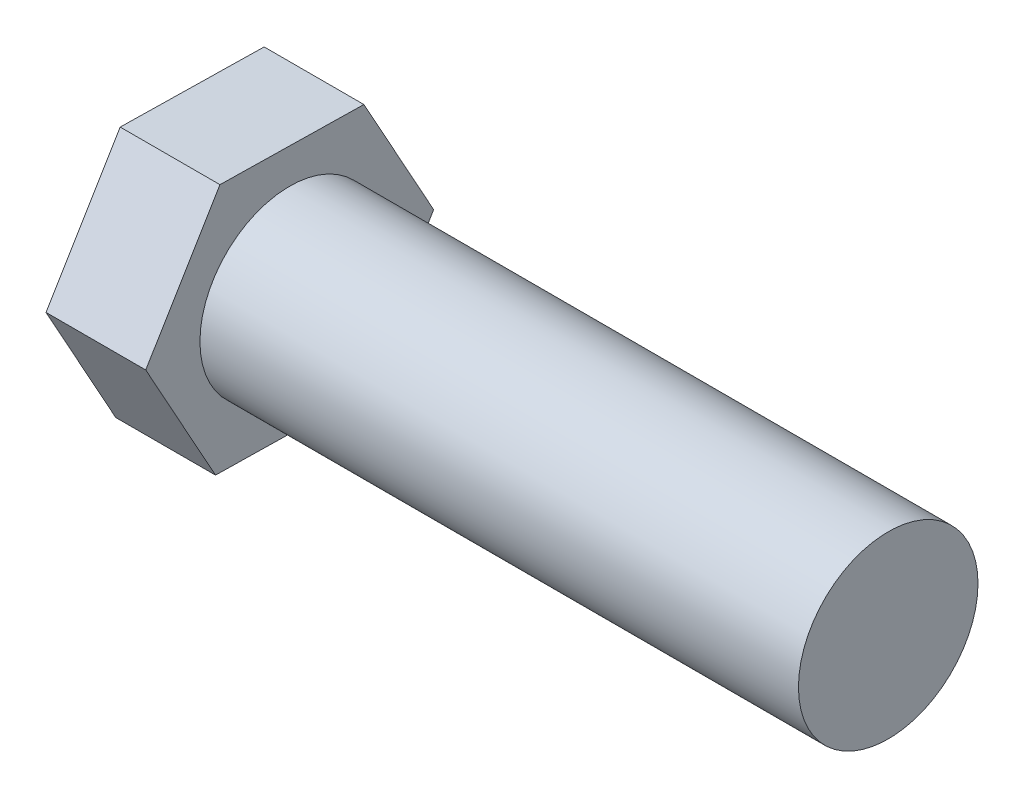
ISO-10303-21;
HEADER;
FILE_DESCRIPTION(('STEP AP214'),'2;1');
FILE_NAME('part.step','',(''),(''),'','','');
FILE_SCHEMA(('AUTOMOTIVE_DESIGN { 1 0 10303 214 1 1 1 1 }'));
ENDSEC;
DATA;
#1=APPLICATION_CONTEXT('core data for automotive mechanical design processes');
#2=APPLICATION_PROTOCOL_DEFINITION('international standard','automotive_design',2000,#1);
#3=PRODUCT_CONTEXT('',#1,'mechanical');
#4=PRODUCT('Part','Part','',(#3));
#5=PRODUCT_RELATED_PRODUCT_CATEGORY('part','',(#4));
#6=PRODUCT_DEFINITION_FORMATION('','',#4);
#7=PRODUCT_DEFINITION_CONTEXT('part definition',#1,'design');
#8=PRODUCT_DEFINITION('design','',#6,#7);
#9=PRODUCT_DEFINITION_SHAPE('','',#8);
#10=(LENGTH_UNIT() NAMED_UNIT(*) SI_UNIT(.MILLI.,.METRE.));
#11=(NAMED_UNIT(*) PLANE_ANGLE_UNIT() SI_UNIT($,.RADIAN.));
#12=(NAMED_UNIT(*) SI_UNIT($,.STERADIAN.) SOLID_ANGLE_UNIT());
#13=UNCERTAINTY_MEASURE_WITH_UNIT(LENGTH_MEASURE(1.E-05),#10,'distance_accuracy_value','');
#14=(GEOMETRIC_REPRESENTATION_CONTEXT(3) GLOBAL_UNCERTAINTY_ASSIGNED_CONTEXT((#13)) GLOBAL_UNIT_ASSIGNED_CONTEXT((#10,
#11,#12)) REPRESENTATION_CONTEXT('',''));
#15=CARTESIAN_POINT('',(0.,0.,0.));
#16=DIRECTION('',(0.,0.,1.));
#17=DIRECTION('',(1.,0.,0.));
#18=AXIS2_PLACEMENT_3D('',#15,#16,#17);
#19=CARTESIAN_POINT('',(-0.6,0.,0.));
#20=DIRECTION('',(-1.,0.,0.));
#21=DIRECTION('',(0.,0.,1.));
#22=AXIS2_PLACEMENT_3D('',#19,#20,#21);
#23=PLANE('',#22);
#24=DIRECTION('',(0.,0.856988725408425,-0.515335157468267));
#25=VECTOR('',#24,1.);
#26=CARTESIAN_POINT('',(-0.6,0.256906077015476,14.4314702161951));
#27=LINE('',#26,#25);
#28=CARTESIAN_POINT('',(-0.6,0.256906077015476,14.4314702161951));
#29=VERTEX_POINT('',#28);
#30=CARTESIAN_POINT('',(-0.6,12.6264728596912,6.99324791901554));
#31=VERTEX_POINT('',#30);
#32=EDGE_CURVE('E126',#29,#31,#27,.T.);
#33=ORIENTED_EDGE('',*,*,#32,.F.);
#34=DIRECTION('',(0.,0.874787700534985,0.484506428226409));
#35=VECTOR('',#34,1.);
#36=CARTESIAN_POINT('',(-0.6,-12.3695667826757,7.43822229717955));
#37=LINE('',#36,#35);
#38=CARTESIAN_POINT('',(-0.6,-12.3695667826757,7.43822229717955));
#39=VERTEX_POINT('',#38);
#40=EDGE_CURVE('E86',#39,#29,#37,.T.);
#41=ORIENTED_EDGE('',*,*,#40,.F.);
#42=DIRECTION('',(0.,0.0177989751265602,0.999841585694676));
#43=VECTOR('',#42,1.);
#44=CARTESIAN_POINT('',(-0.6,-12.6264728596912,-6.99324791901554));
#45=LINE('',#44,#43);
#46=CARTESIAN_POINT('',(-0.6,-12.6264728596912,-6.99324791901554));
#47=VERTEX_POINT('',#46);
#48=EDGE_CURVE('E80',#47,#39,#45,.T.);
#49=ORIENTED_EDGE('',*,*,#48,.F.);
#50=DIRECTION('',(0.,-0.856988725408425,0.515335157468266));
#51=VECTOR('',#50,1.);
#52=CARTESIAN_POINT('',(-0.6,-0.256906077015476,-14.4314702161951));
#53=LINE('',#52,#51);
#54=CARTESIAN_POINT('',(-0.6,-0.256906077015476,-14.4314702161951));
#55=VERTEX_POINT('',#54);
#56=EDGE_CURVE('E116',#55,#47,#53,.T.);
#57=ORIENTED_EDGE('',*,*,#56,.F.);
#58=DIRECTION('',(0.,-0.874787700534985,-0.484506428226409));
#59=VECTOR('',#58,1.);
#60=CARTESIAN_POINT('',(-0.6,12.3695667826757,-7.43822229717955));
#61=LINE('',#60,#59);
#62=CARTESIAN_POINT('',(-0.6,12.3695667826757,-7.43822229717955));
#63=VERTEX_POINT('',#62);
#64=EDGE_CURVE('E131',#63,#55,#61,.T.);
#65=ORIENTED_EDGE('',*,*,#64,.F.);
#66=DIRECTION('',(0.,-0.01779897512656,-0.999841585694676));
#67=VECTOR('',#66,1.);
#68=CARTESIAN_POINT('',(-0.6,12.6264728596912,6.99324791901554));
#69=LINE('',#68,#67);
#70=EDGE_CURVE('E129',#31,#63,#69,.T.);
#71=ORIENTED_EDGE('',*,*,#70,.F.);
#72=EDGE_LOOP('',(#33,#41,#49,#57,#65,#71));
#73=FACE_BOUND('',#72,.T.);
#74=CARTESIAN_POINT('',(-0.600000000000003,0.,0.));
#75=DIRECTION('',(-1.,0.,0.));
#76=DIRECTION('',(0.,0.,1.));
#77=AXIS2_PLACEMENT_3D('',#74,#75,#76);
#78=CIRCLE('',#77,9.);
#79=CARTESIAN_POINT('',(-0.600000000000003,0.,9.));
#80=VERTEX_POINT('',#79);
#81=EDGE_CURVE('E49',#80,#80,#78,.T.);
#82=ORIENTED_EDGE('',*,*,#81,.T.);
#83=EDGE_LOOP('',(#82));
#84=FACE_BOUND('',#83,.T.);
#85=ADVANCED_FACE('F40',(#73,#84),#23,.F.);
#86=CARTESIAN_POINT('',(-10.6,0.256906077015476,14.4314702161951));
#87=DIRECTION('',(0.,-0.515335157468267,-0.856988725408425));
#88=DIRECTION('',(0.,0.856988725408425,-0.515335157468267));
#89=AXIS2_PLACEMENT_3D('',#86,#87,#88);
#90=PLANE('',#89);
#91=ORIENTED_EDGE('',*,*,#32,.T.);
#92=DIRECTION('',(1.,0.,0.));
#93=VECTOR('',#92,1.);
#94=CARTESIAN_POINT('',(-10.6,12.6264728596912,6.99324791901554));
#95=LINE('',#94,#93);
#96=CARTESIAN_POINT('',(-10.6,12.6264728596912,6.99324791901554));
#97=VERTEX_POINT('',#96);
#98=EDGE_CURVE('E143',#97,#31,#95,.T.);
#99=ORIENTED_EDGE('',*,*,#98,.F.);
#100=DIRECTION('',(0.,0.856988725408425,-0.515335157468267));
#101=VECTOR('',#100,1.);
#102=CARTESIAN_POINT('',(-10.6,0.256906077015476,14.4314702161951));
#103=LINE('',#102,#101);
#104=CARTESIAN_POINT('',(-10.6,0.256906077015476,14.4314702161951));
#105=VERTEX_POINT('',#104);
#106=EDGE_CURVE('E136',#105,#97,#103,.T.);
#107=ORIENTED_EDGE('',*,*,#106,.F.);
#108=DIRECTION('',(1.,0.,0.));
#109=VECTOR('',#108,1.);
#110=CARTESIAN_POINT('',(-10.6,0.256906077015476,14.4314702161951));
#111=LINE('',#110,#109);
#112=EDGE_CURVE('E122',#105,#29,#111,.T.);
#113=ORIENTED_EDGE('',*,*,#112,.T.);
#114=EDGE_LOOP('',(#91,#99,#107,#113));
#115=FACE_BOUND('',#114,.T.);
#116=ADVANCED_FACE('F160',(#115),#90,.F.);
#117=CARTESIAN_POINT('',(-10.6,12.6264728596912,6.99324791901554));
#118=DIRECTION('',(0.,-0.999841585694676,0.01779897512656));
#119=DIRECTION('',(0.,-0.01779897512656,-0.999841585694676));
#120=AXIS2_PLACEMENT_3D('',#117,#118,#119);
#121=PLANE('',#120);
#122=ORIENTED_EDGE('',*,*,#70,.T.);
#123=DIRECTION('',(1.,0.,0.));
#124=VECTOR('',#123,1.);
#125=CARTESIAN_POINT('',(-10.6,12.3695667826757,-7.43822229717955));
#126=LINE('',#125,#124);
#127=CARTESIAN_POINT('',(-10.6,12.3695667826757,-7.43822229717955));
#128=VERTEX_POINT('',#127);
#129=EDGE_CURVE('E140',#128,#63,#126,.T.);
#130=ORIENTED_EDGE('',*,*,#129,.F.);
#131=DIRECTION('',(0.,-0.01779897512656,-0.999841585694676));
#132=VECTOR('',#131,1.);
#133=CARTESIAN_POINT('',(-10.6,12.6264728596912,6.99324791901554));
#134=LINE('',#133,#132);
#135=EDGE_CURVE('E95',#97,#128,#134,.T.);
#136=ORIENTED_EDGE('',*,*,#135,.F.);
#137=ORIENTED_EDGE('',*,*,#98,.T.);
#138=EDGE_LOOP('',(#122,#130,#136,#137));
#139=FACE_BOUND('',#138,.T.);
#140=ADVANCED_FACE('F166',(#139),#121,.F.);
#141=CARTESIAN_POINT('',(-10.6,12.3695667826757,-7.43822229717955));
#142=DIRECTION('',(0.,-0.484506428226409,0.874787700534986));
#143=DIRECTION('',(0.,-0.874787700534986,-0.484506428226409));
#144=AXIS2_PLACEMENT_3D('',#141,#142,#143);
#145=PLANE('',#144);
#146=ORIENTED_EDGE('',*,*,#64,.T.);
#147=DIRECTION('',(1.,0.,0.));
#148=VECTOR('',#147,1.);
#149=CARTESIAN_POINT('',(-10.6,-0.256906077015476,-14.4314702161951));
#150=LINE('',#149,#148);
#151=CARTESIAN_POINT('',(-10.6,-0.256906077015476,-14.4314702161951));
#152=VERTEX_POINT('',#151);
#153=EDGE_CURVE('E117',#152,#55,#150,.T.);
#154=ORIENTED_EDGE('',*,*,#153,.F.);
#155=DIRECTION('',(0.,-0.874787700534985,-0.484506428226409));
#156=VECTOR('',#155,1.);
#157=CARTESIAN_POINT('',(-10.6,12.3695667826757,-7.43822229717955));
#158=LINE('',#157,#156);
#159=EDGE_CURVE('E108',#128,#152,#158,.T.);
#160=ORIENTED_EDGE('',*,*,#159,.F.);
#161=ORIENTED_EDGE('',*,*,#129,.T.);
#162=EDGE_LOOP('',(#146,#154,#160,#161));
#163=FACE_BOUND('',#162,.T.);
#164=ADVANCED_FACE('F177',(#163),#145,.F.);
#165=CARTESIAN_POINT('',(-10.6,-0.256906077015476,-14.4314702161951));
#166=DIRECTION('',(0.,0.515335157468266,0.856988725408425));
#167=DIRECTION('',(0.,-0.856988725408425,0.515335157468266));
#168=AXIS2_PLACEMENT_3D('',#165,#166,#167);
#169=PLANE('',#168);
#170=ORIENTED_EDGE('',*,*,#56,.T.);
#171=DIRECTION('',(1.,0.,0.));
#172=VECTOR('',#171,1.);
#173=CARTESIAN_POINT('',(-10.6,-12.6264728596912,-6.99324791901554));
#174=LINE('',#173,#172);
#175=CARTESIAN_POINT('',(-10.6,-12.6264728596912,-6.99324791901554));
#176=VERTEX_POINT('',#175);
#177=EDGE_CURVE('E113',#176,#47,#174,.T.);
#178=ORIENTED_EDGE('',*,*,#177,.F.);
#179=DIRECTION('',(0.,-0.856988725408425,0.515335157468266));
#180=VECTOR('',#179,1.);
#181=CARTESIAN_POINT('',(-10.6,-0.256906077015476,-14.4314702161951));
#182=LINE('',#181,#180);
#183=EDGE_CURVE('E102',#152,#176,#182,.T.);
#184=ORIENTED_EDGE('',*,*,#183,.F.);
#185=ORIENTED_EDGE('',*,*,#153,.T.);
#186=EDGE_LOOP('',(#170,#178,#184,#185));
#187=FACE_BOUND('',#186,.T.);
#188=ADVANCED_FACE('F114',(#187),#169,.F.);
#189=CARTESIAN_POINT('',(-10.6,-12.6264728596912,-6.99324791901554));
#190=DIRECTION('',(0.,0.999841585694676,-0.0177989751265602));
#191=DIRECTION('',(0.,0.0177989751265602,0.999841585694676));
#192=AXIS2_PLACEMENT_3D('',#189,#190,#191);
#193=PLANE('',#192);
#194=ORIENTED_EDGE('',*,*,#48,.T.);
#195=DIRECTION('',(1.,0.,0.));
#196=VECTOR('',#195,1.);
#197=CARTESIAN_POINT('',(-10.6,-12.3695667826757,7.43822229717955));
#198=LINE('',#197,#196);
#199=CARTESIAN_POINT('',(-10.6,-12.3695667826757,7.43822229717955));
#200=VERTEX_POINT('',#199);
#201=EDGE_CURVE('E118',#200,#39,#198,.T.);
#202=ORIENTED_EDGE('',*,*,#201,.F.);
#203=DIRECTION('',(0.,0.0177989751265602,0.999841585694676));
#204=VECTOR('',#203,1.);
#205=CARTESIAN_POINT('',(-10.6,-12.6264728596912,-6.99324791901554));
#206=LINE('',#205,#204);
#207=EDGE_CURVE('E106',#176,#200,#206,.T.);
#208=ORIENTED_EDGE('',*,*,#207,.F.);
#209=ORIENTED_EDGE('',*,*,#177,.T.);
#210=EDGE_LOOP('',(#194,#202,#208,#209));
#211=FACE_BOUND('',#210,.T.);
#212=ADVANCED_FACE('F120',(#211),#193,.F.);
#213=CARTESIAN_POINT('',(-10.6,-12.3695667826757,7.43822229717955));
#214=DIRECTION('',(0.,0.48450642822641,-0.874787700534985));
#215=DIRECTION('',(0.,0.874787700534985,0.48450642822641));
#216=AXIS2_PLACEMENT_3D('',#213,#214,#215);
#217=PLANE('',#216);
#218=ORIENTED_EDGE('',*,*,#40,.T.);
#219=ORIENTED_EDGE('',*,*,#112,.F.);
#220=DIRECTION('',(0.,0.874787700534985,0.484506428226409));
#221=VECTOR('',#220,1.);
#222=CARTESIAN_POINT('',(-10.6,-12.3695667826757,7.43822229717955));
#223=LINE('',#222,#221);
#224=EDGE_CURVE('E57',#200,#105,#223,.T.);
#225=ORIENTED_EDGE('',*,*,#224,.F.);
#226=ORIENTED_EDGE('',*,*,#201,.T.);
#227=EDGE_LOOP('',(#218,#219,#225,#226));
#228=FACE_BOUND('',#227,.T.);
#229=ADVANCED_FACE('F156',(#228),#217,.F.);
#230=CARTESIAN_POINT('',(-10.6,0.,0.));
#231=DIRECTION('',(-1.,0.,0.));
#232=DIRECTION('',(0.,0.,1.));
#233=AXIS2_PLACEMENT_3D('',#230,#231,#232);
#234=PLANE('',#233);
#235=ORIENTED_EDGE('',*,*,#106,.T.);
#236=ORIENTED_EDGE('',*,*,#135,.T.);
#237=ORIENTED_EDGE('',*,*,#159,.T.);
#238=ORIENTED_EDGE('',*,*,#183,.T.);
#239=ORIENTED_EDGE('',*,*,#207,.T.);
#240=ORIENTED_EDGE('',*,*,#224,.T.);
#241=EDGE_LOOP('',(#235,#236,#237,#238,#239,#240));
#242=FACE_BOUND('',#241,.T.);
#243=ADVANCED_FACE('F104',(#242),#234,.T.);
#244=CARTESIAN_POINT('',(59.4,0.,0.));
#245=DIRECTION('',(-1.,0.,0.));
#246=DIRECTION('',(0.,0.,1.));
#247=AXIS2_PLACEMENT_3D('',#244,#245,#246);
#248=CYLINDRICAL_SURFACE('',#247,9.);
#249=CARTESIAN_POINT('',(59.4,0.,0.));
#250=DIRECTION('',(1.,0.,0.));
#251=DIRECTION('',(0.,0.,-1.));
#252=AXIS2_PLACEMENT_3D('',#249,#250,#251);
#253=CIRCLE('',#252,9.);
#254=CARTESIAN_POINT('',(59.4,0.,-9.));
#255=VERTEX_POINT('',#254);
#256=EDGE_CURVE('E11',#255,#255,#253,.T.);
#257=ORIENTED_EDGE('',*,*,#256,.F.);
#258=EDGE_LOOP('',(#257));
#259=FACE_BOUND('',#258,.T.);
#260=ORIENTED_EDGE('',*,*,#81,.F.);
#261=EDGE_LOOP('',(#260));
#262=FACE_BOUND('',#261,.T.);
#263=ADVANCED_FACE('F42',(#259,#262),#248,.T.);
#264=CARTESIAN_POINT('',(59.4,0.,0.));
#265=DIRECTION('',(1.,0.,0.));
#266=DIRECTION('',(0.,0.,-1.));
#267=AXIS2_PLACEMENT_3D('',#264,#265,#266);
#268=PLANE('',#267);
#269=ORIENTED_EDGE('',*,*,#256,.T.);
#270=EDGE_LOOP('',(#269));
#271=FACE_BOUND('',#270,.T.);
#272=ADVANCED_FACE('F149',(#271),#268,.T.);
#273=CLOSED_SHELL('',(#85,#116,#140,#164,#188,#212,#229,#243,#263,#272));
#274=MANIFOLD_SOLID_BREP('B2',#273);
#275=ADVANCED_BREP_SHAPE_REPRESENTATION('',(#18,#274),#14);
#276=SHAPE_DEFINITION_REPRESENTATION(#9,#275);
ENDSEC;
END-ISO-10303-21;
